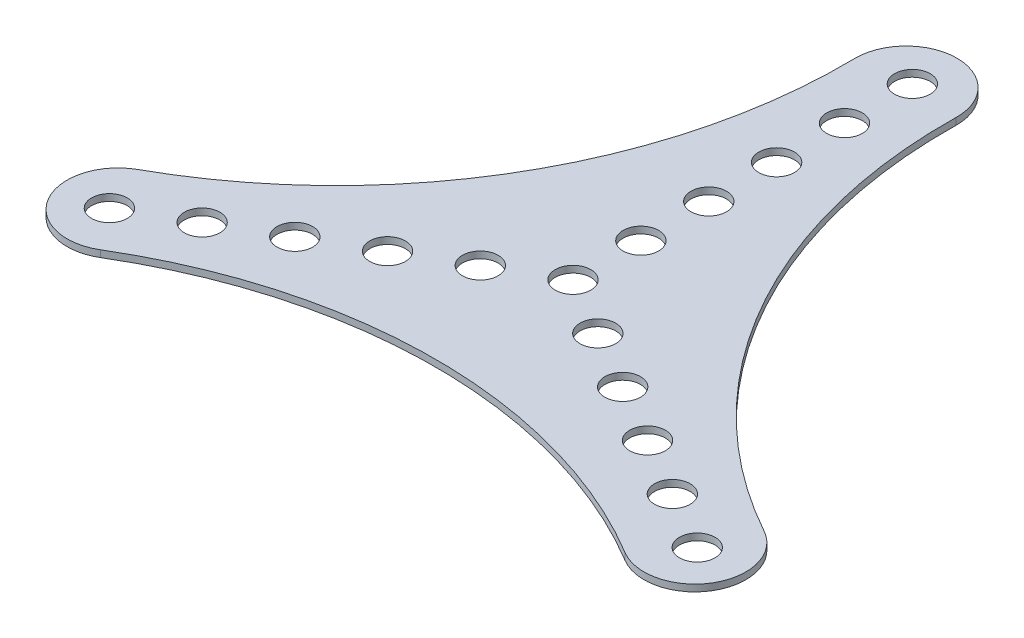
ISO-10303-21;
HEADER;
FILE_DESCRIPTION(('STEP AP214'),'2;1');
FILE_NAME('part.step','',(''),(''),'','','');
FILE_SCHEMA(('AUTOMOTIVE_DESIGN { 1 0 10303 214 1 1 1 1 }'));
ENDSEC;
DATA;
#1=APPLICATION_CONTEXT('core data for automotive mechanical design processes');
#2=APPLICATION_PROTOCOL_DEFINITION('international standard','automotive_design',2000,#1);
#3=PRODUCT_CONTEXT('',#1,'mechanical');
#4=PRODUCT('Part','Part','',(#3));
#5=PRODUCT_RELATED_PRODUCT_CATEGORY('part','',(#4));
#6=PRODUCT_DEFINITION_FORMATION('','',#4);
#7=PRODUCT_DEFINITION_CONTEXT('part definition',#1,'design');
#8=PRODUCT_DEFINITION('design','',#6,#7);
#9=PRODUCT_DEFINITION_SHAPE('','',#8);
#10=(LENGTH_UNIT() NAMED_UNIT(*) SI_UNIT(.MILLI.,.METRE.));
#11=(NAMED_UNIT(*) PLANE_ANGLE_UNIT() SI_UNIT($,.RADIAN.));
#12=(NAMED_UNIT(*) SI_UNIT($,.STERADIAN.) SOLID_ANGLE_UNIT());
#13=UNCERTAINTY_MEASURE_WITH_UNIT(LENGTH_MEASURE(1.E-05),#10,'distance_accuracy_value','');
#14=(GEOMETRIC_REPRESENTATION_CONTEXT(3) GLOBAL_UNCERTAINTY_ASSIGNED_CONTEXT((#13)) GLOBAL_UNIT_ASSIGNED_CONTEXT((#10,
#11,#12)) REPRESENTATION_CONTEXT('',''));
#15=CARTESIAN_POINT('',(0.,0.,0.));
#16=DIRECTION('',(0.,0.,1.));
#17=DIRECTION('',(1.,0.,0.));
#18=AXIS2_PLACEMENT_3D('',#15,#16,#17);
#19=CARTESIAN_POINT('',(164.974487139159,1.,-95.2480645592133));
#20=DIRECTION('',(0.,-1.,0.));
#21=DIRECTION('',(0.,0.,-1.));
#22=AXIS2_PLACEMENT_3D('',#19,#20,#21);
#23=CYLINDRICAL_SURFACE('',#22,150.);
#24=CARTESIAN_POINT('',(164.974487139159,-1.,-95.2480645592133));
#25=DIRECTION('',(0.,1.,0.));
#26=DIRECTION('',(0.,0.,1.));
#27=AXIS2_PLACEMENT_3D('',#24,#25,#26);
#28=CIRCLE('',#27,150.);
#29=CARTESIAN_POINT('',(14.9976806490144,-1.,-97.88577474378));
#30=VERTEX_POINT('',#29);
#31=CARTESIAN_POINT('',(92.2704079217417,-1.,35.9545149319977));
#32=VERTEX_POINT('',#31);
#33=EDGE_CURVE('E116',#30,#32,#28,.T.);
#34=ORIENTED_EDGE('',*,*,#33,.F.);
#35=DIRECTION('',(0.,-1.,0.));
#36=VECTOR('',#35,1.);
#37=CARTESIAN_POINT('',(14.9976806490144,1.,-97.88577474378));
#38=LINE('',#37,#36);
#39=CARTESIAN_POINT('',(14.9976806490144,1.,-97.88577474378));
#40=VERTEX_POINT('',#39);
#41=EDGE_CURVE('E11',#40,#30,#38,.T.);
#42=ORIENTED_EDGE('',*,*,#41,.F.);
#43=CARTESIAN_POINT('',(164.974487139159,1.,-95.2480645592133));
#44=DIRECTION('',(0.,1.,0.));
#45=DIRECTION('',(0.,0.,1.));
#46=AXIS2_PLACEMENT_3D('',#43,#44,#45);
#47=CIRCLE('',#46,150.);
#48=CARTESIAN_POINT('',(92.2704079217417,1.,35.9545149319977));
#49=VERTEX_POINT('',#48);
#50=EDGE_CURVE('E129',#40,#49,#47,.T.);
#51=ORIENTED_EDGE('',*,*,#50,.T.);
#52=DIRECTION('',(0.,-1.,0.));
#53=VECTOR('',#52,1.);
#54=CARTESIAN_POINT('',(92.2704079217417,1.,35.9545149319977));
#55=LINE('',#54,#53);
#56=EDGE_CURVE('E50',#49,#32,#55,.T.);
#57=ORIENTED_EDGE('',*,*,#56,.T.);
#58=EDGE_LOOP('',(#34,#42,#51,#57));
#59=FACE_BOUND('',#58,.T.);
#60=ADVANCED_FACE('F34',(#59),#23,.F.);
#61=CARTESIAN_POINT('',(0.,1.,-98.1495457622367));
#62=DIRECTION('',(0.,-1.,0.));
#63=DIRECTION('',(0.,0.,-1.));
#64=AXIS2_PLACEMENT_3D('',#61,#62,#63);
#65=CYLINDRICAL_SURFACE('',#64,15.);
#66=CARTESIAN_POINT('',(0.,-1.,-98.1495457622367));
#67=DIRECTION('',(0.,1.,0.));
#68=DIRECTION('',(0.,0.,1.));
#69=AXIS2_PLACEMENT_3D('',#66,#67,#68);
#70=CIRCLE('',#69,15.);
#71=CARTESIAN_POINT('',(-14.9976806490144,-1.,-97.88577474378));
#72=VERTEX_POINT('',#71);
#73=EDGE_CURVE('E118',#30,#72,#70,.T.);
#74=ORIENTED_EDGE('',*,*,#73,.T.);
#75=DIRECTION('',(0.,-1.,0.));
#76=VECTOR('',#75,1.);
#77=CARTESIAN_POINT('',(-14.9976806490144,1.,-97.88577474378));
#78=LINE('',#77,#76);
#79=CARTESIAN_POINT('',(-14.9976806490144,1.,-97.88577474378));
#80=VERTEX_POINT('',#79);
#81=EDGE_CURVE('E42',#80,#72,#78,.T.);
#82=ORIENTED_EDGE('',*,*,#81,.F.);
#83=CARTESIAN_POINT('',(0.,1.,-98.1495457622367));
#84=DIRECTION('',(0.,1.,0.));
#85=DIRECTION('',(0.,0.,1.));
#86=AXIS2_PLACEMENT_3D('',#83,#84,#85);
#87=CIRCLE('',#86,15.);
#88=EDGE_CURVE('E457',#40,#80,#87,.T.);
#89=ORIENTED_EDGE('',*,*,#88,.F.);
#90=ORIENTED_EDGE('',*,*,#41,.T.);
#91=EDGE_LOOP('',(#74,#82,#89,#90));
#92=FACE_BOUND('',#91,.T.);
#93=ADVANCED_FACE('F153',(#92),#65,.T.);
#94=CARTESIAN_POINT('',(-164.974487139159,1.,-95.2480645592133));
#95=DIRECTION('',(0.,-1.,0.));
#96=DIRECTION('',(0.,0.,-1.));
#97=AXIS2_PLACEMENT_3D('',#94,#95,#96);
#98=CYLINDRICAL_SURFACE('',#97,150.);
#99=CARTESIAN_POINT('',(-164.974487139159,-1.,-95.2480645592133));
#100=DIRECTION('',(0.,1.,0.));
#101=DIRECTION('',(0.,0.,1.));
#102=AXIS2_PLACEMENT_3D('',#99,#100,#101);
#103=CIRCLE('',#102,150.);
#104=CARTESIAN_POINT('',(-92.2704079217417,-1.,35.9545149319977));
#105=VERTEX_POINT('',#104);
#106=EDGE_CURVE('E121',#72,#105,#103,.F.);
#107=ORIENTED_EDGE('',*,*,#106,.T.);
#108=DIRECTION('',(0.,-1.,0.));
#109=VECTOR('',#108,1.);
#110=CARTESIAN_POINT('',(-92.2704079217417,1.,35.9545149319977));
#111=LINE('',#110,#109);
#112=CARTESIAN_POINT('',(-92.2704079217417,1.,35.9545149319977));
#113=VERTEX_POINT('',#112);
#114=EDGE_CURVE('E108',#113,#105,#111,.T.);
#115=ORIENTED_EDGE('',*,*,#114,.F.);
#116=CARTESIAN_POINT('',(-164.974487139159,1.,-95.2480645592133));
#117=DIRECTION('',(0.,1.,0.));
#118=DIRECTION('',(0.,0.,1.));
#119=AXIS2_PLACEMENT_3D('',#116,#117,#118);
#120=CIRCLE('',#119,150.);
#121=EDGE_CURVE('E96',#80,#113,#120,.F.);
#122=ORIENTED_EDGE('',*,*,#121,.F.);
#123=ORIENTED_EDGE('',*,*,#81,.T.);
#124=EDGE_LOOP('',(#107,#115,#122,#123));
#125=FACE_BOUND('',#124,.T.);
#126=ADVANCED_FACE('F136',(#125),#98,.F.);
#127=CARTESIAN_POINT('',(-85.,1.,49.0747728811188));
#128=DIRECTION('',(0.,-1.,0.));
#129=DIRECTION('',(0.,0.,-1.));
#130=AXIS2_PLACEMENT_3D('',#127,#128,#129);
#131=CYLINDRICAL_SURFACE('',#130,15.);
#132=CARTESIAN_POINT('',(-85.,-1.,49.0747728811188));
#133=DIRECTION('',(0.,1.,0.));
#134=DIRECTION('',(0.,0.,1.));
#135=AXIS2_PLACEMENT_3D('',#132,#133,#134);
#136=CIRCLE('',#135,15.);
#137=CARTESIAN_POINT('',(-77.2727272727273,-1.,61.9312598117833));
#138=VERTEX_POINT('',#137);
#139=EDGE_CURVE('E105',#105,#138,#136,.T.);
#140=ORIENTED_EDGE('',*,*,#139,.T.);
#141=DIRECTION('',(0.,-1.,0.));
#142=VECTOR('',#141,1.);
#143=CARTESIAN_POINT('',(-77.2727272727273,1.,61.9312598117833));
#144=LINE('',#143,#142);
#145=CARTESIAN_POINT('',(-77.2727272727273,1.,61.9312598117833));
#146=VERTEX_POINT('',#145);
#147=EDGE_CURVE('E102',#146,#138,#144,.T.);
#148=ORIENTED_EDGE('',*,*,#147,.F.);
#149=CARTESIAN_POINT('',(-85.,1.,49.0747728811188));
#150=DIRECTION('',(0.,1.,0.));
#151=DIRECTION('',(0.,0.,1.));
#152=AXIS2_PLACEMENT_3D('',#149,#150,#151);
#153=CIRCLE('',#152,15.);
#154=EDGE_CURVE('E88',#113,#146,#153,.T.);
#155=ORIENTED_EDGE('',*,*,#154,.F.);
#156=ORIENTED_EDGE('',*,*,#114,.T.);
#157=EDGE_LOOP('',(#140,#148,#155,#156));
#158=FACE_BOUND('',#157,.T.);
#159=ADVANCED_FACE('F103',(#158),#131,.T.);
#160=CARTESIAN_POINT('',(0.,1.,190.496129118428));
#161=DIRECTION('',(0.,-1.,0.));
#162=DIRECTION('',(0.,0.,-1.));
#163=AXIS2_PLACEMENT_3D('',#160,#161,#162);
#164=CYLINDRICAL_SURFACE('',#163,150.);
#165=CARTESIAN_POINT('',(0.,-1.,190.496129118428));
#166=DIRECTION('',(0.,1.,0.));
#167=DIRECTION('',(0.,0.,1.));
#168=AXIS2_PLACEMENT_3D('',#165,#166,#167);
#169=CIRCLE('',#168,150.);
#170=CARTESIAN_POINT('',(77.2727272727273,-1.,61.9312598117832));
#171=VERTEX_POINT('',#170);
#172=EDGE_CURVE('E124',#171,#138,#169,.T.);
#173=ORIENTED_EDGE('',*,*,#172,.F.);
#174=DIRECTION('',(0.,-1.,0.));
#175=VECTOR('',#174,1.);
#176=CARTESIAN_POINT('',(77.2727272727273,1.,61.9312598117832));
#177=LINE('',#176,#175);
#178=CARTESIAN_POINT('',(77.2727272727273,1.,61.9312598117832));
#179=VERTEX_POINT('',#178);
#180=EDGE_CURVE('E69',#179,#171,#177,.T.);
#181=ORIENTED_EDGE('',*,*,#180,.F.);
#182=CARTESIAN_POINT('',(0.,1.,190.496129118428));
#183=DIRECTION('',(0.,1.,0.));
#184=DIRECTION('',(0.,0.,1.));
#185=AXIS2_PLACEMENT_3D('',#182,#183,#184);
#186=CIRCLE('',#185,150.);
#187=EDGE_CURVE('E94',#179,#146,#186,.T.);
#188=ORIENTED_EDGE('',*,*,#187,.T.);
#189=ORIENTED_EDGE('',*,*,#147,.T.);
#190=EDGE_LOOP('',(#173,#181,#188,#189));
#191=FACE_BOUND('',#190,.T.);
#192=ADVANCED_FACE('F110',(#191),#164,.F.);
#193=CARTESIAN_POINT('',(85.,1.,49.0747728811187));
#194=DIRECTION('',(0.,-1.,0.));
#195=DIRECTION('',(0.,0.,-1.));
#196=AXIS2_PLACEMENT_3D('',#193,#194,#195);
#197=CYLINDRICAL_SURFACE('',#196,15.);
#198=CARTESIAN_POINT('',(85.,-1.,49.0747728811187));
#199=DIRECTION('',(0.,1.,0.));
#200=DIRECTION('',(0.,0.,1.));
#201=AXIS2_PLACEMENT_3D('',#198,#199,#200);
#202=CIRCLE('',#201,15.);
#203=EDGE_CURVE('E126',#32,#171,#202,.F.);
#204=ORIENTED_EDGE('',*,*,#203,.F.);
#205=ORIENTED_EDGE('',*,*,#56,.F.);
#206=CARTESIAN_POINT('',(85.,1.,49.0747728811187));
#207=DIRECTION('',(0.,1.,0.));
#208=DIRECTION('',(0.,0.,1.));
#209=AXIS2_PLACEMENT_3D('',#206,#207,#208);
#210=CIRCLE('',#209,15.);
#211=EDGE_CURVE('E111',#49,#179,#210,.F.);
#212=ORIENTED_EDGE('',*,*,#211,.T.);
#213=ORIENTED_EDGE('',*,*,#180,.T.);
#214=EDGE_LOOP('',(#204,#205,#212,#213));
#215=FACE_BOUND('',#214,.T.);
#216=ADVANCED_FACE('F141',(#215),#197,.T.);
#217=CARTESIAN_POINT('',(0.,1.,0.));
#218=DIRECTION('',(0.,1.,0.));
#219=DIRECTION('',(0.,0.,1.));
#220=AXIS2_PLACEMENT_3D('',#217,#218,#219);
#221=PLANE('',#220);
#222=CARTESIAN_POINT('',(69.2820323027555,1.,39.9999999999994));
#223=DIRECTION('',(0.,1.,0.));
#224=DIRECTION('',(-0.866025403784443,0.,-0.499999999999992));
#225=AXIS2_PLACEMENT_3D('',#222,#223,#224);
#226=CIRCLE('',#225,5.25);
#227=CARTESIAN_POINT('',(64.7353989328871,1.,37.3749999999994));
#228=VERTEX_POINT('',#227);
#229=EDGE_CURVE('E360',#228,#228,#226,.T.);
#230=ORIENTED_EDGE('',*,*,#229,.F.);
#231=EDGE_LOOP('',(#230));
#232=FACE_BOUND('',#231,.T.);
#233=CARTESIAN_POINT('',(-69.2820323027549,1.,40.0000000000003));
#234=DIRECTION('',(0.,1.,0.));
#235=DIRECTION('',(0.866025403784436,0.,-0.500000000000004));
#236=AXIS2_PLACEMENT_3D('',#233,#234,#235);
#237=CIRCLE('',#236,5.25);
#238=CARTESIAN_POINT('',(-64.7353989328866,1.,37.3750000000003));
#239=VERTEX_POINT('',#238);
#240=EDGE_CURVE('E364',#239,#239,#237,.T.);
#241=ORIENTED_EDGE('',*,*,#240,.F.);
#242=EDGE_LOOP('',(#241));
#243=FACE_BOUND('',#242,.T.);
#244=CARTESIAN_POINT('',(51.9615242270666,1.,29.9999999999995));
#245=DIRECTION('',(0.,1.,0.));
#246=DIRECTION('',(-0.866025403784443,0.,-0.499999999999992));
#247=AXIS2_PLACEMENT_3D('',#244,#245,#246);
#248=CIRCLE('',#247,5.25);
#249=CARTESIAN_POINT('',(47.4148908571983,1.,27.3749999999996));
#250=VERTEX_POINT('',#249);
#251=EDGE_CURVE('E373',#250,#250,#248,.T.);
#252=ORIENTED_EDGE('',*,*,#251,.F.);
#253=EDGE_LOOP('',(#252));
#254=FACE_BOUND('',#253,.T.);
#255=CARTESIAN_POINT('',(-51.9615242270662,1.,30.0000000000002));
#256=DIRECTION('',(0.,1.,0.));
#257=DIRECTION('',(0.866025403784436,0.,-0.500000000000004));
#258=AXIS2_PLACEMENT_3D('',#255,#256,#257);
#259=CIRCLE('',#258,5.25);
#260=CARTESIAN_POINT('',(-47.4148908571979,1.,27.3750000000002));
#261=VERTEX_POINT('',#260);
#262=EDGE_CURVE('E379',#261,#261,#259,.T.);
#263=ORIENTED_EDGE('',*,*,#262,.F.);
#264=EDGE_LOOP('',(#263));
#265=FACE_BOUND('',#264,.T.);
#266=CARTESIAN_POINT('',(34.6410161513777,1.,19.9999999999997));
#267=DIRECTION('',(0.,1.,0.));
#268=DIRECTION('',(-0.866025403784443,0.,-0.499999999999992));
#269=AXIS2_PLACEMENT_3D('',#266,#267,#268);
#270=CIRCLE('',#269,5.25);
#271=CARTESIAN_POINT('',(30.0943827815094,1.,17.3749999999997));
#272=VERTEX_POINT('',#271);
#273=EDGE_CURVE('E385',#272,#272,#270,.T.);
#274=ORIENTED_EDGE('',*,*,#273,.F.);
#275=EDGE_LOOP('',(#274));
#276=FACE_BOUND('',#275,.T.);
#277=CARTESIAN_POINT('',(-34.6410161513775,1.,20.0000000000002));
#278=DIRECTION('',(0.,1.,0.));
#279=DIRECTION('',(0.866025403784436,0.,-0.500000000000004));
#280=AXIS2_PLACEMENT_3D('',#277,#278,#279);
#281=CIRCLE('',#280,5.25);
#282=CARTESIAN_POINT('',(-30.0943827815092,1.,17.3750000000001));
#283=VERTEX_POINT('',#282);
#284=EDGE_CURVE('E391',#283,#283,#281,.T.);
#285=ORIENTED_EDGE('',*,*,#284,.F.);
#286=EDGE_LOOP('',(#285));
#287=FACE_BOUND('',#286,.T.);
#288=CARTESIAN_POINT('',(17.3205080756889,1.,9.99999999999984));
#289=DIRECTION('',(0.,1.,0.));
#290=DIRECTION('',(-0.866025403784443,0.,-0.499999999999992));
#291=AXIS2_PLACEMENT_3D('',#288,#289,#290);
#292=CIRCLE('',#291,5.25);
#293=CARTESIAN_POINT('',(12.7738747058205,1.,7.37499999999988));
#294=VERTEX_POINT('',#293);
#295=EDGE_CURVE('E397',#294,#294,#292,.T.);
#296=ORIENTED_EDGE('',*,*,#295,.F.);
#297=EDGE_LOOP('',(#296));
#298=FACE_BOUND('',#297,.T.);
#299=CARTESIAN_POINT('',(-17.3205080756887,1.,10.0000000000001));
#300=DIRECTION('',(0.,1.,0.));
#301=DIRECTION('',(0.866025403784436,0.,-0.500000000000004));
#302=AXIS2_PLACEMENT_3D('',#299,#300,#301);
#303=CIRCLE('',#302,5.25);
#304=CARTESIAN_POINT('',(-12.7738747058204,1.,7.37500000000006));
#305=VERTEX_POINT('',#304);
#306=EDGE_CURVE('E403',#305,#305,#303,.T.);
#307=ORIENTED_EDGE('',*,*,#306,.F.);
#308=EDGE_LOOP('',(#307));
#309=FACE_BOUND('',#308,.T.);
#310=CARTESIAN_POINT('',(86.6025403784443,1.,49.9999999999992));
#311=DIRECTION('',(0.,1.,0.));
#312=DIRECTION('',(-0.866025403784443,0.,-0.499999999999992));
#313=AXIS2_PLACEMENT_3D('',#310,#311,#312);
#314=CIRCLE('',#313,5.25);
#315=CARTESIAN_POINT('',(82.055907008576,1.,47.3749999999992));
#316=VERTEX_POINT('',#315);
#317=EDGE_CURVE('E409',#316,#316,#314,.T.);
#318=ORIENTED_EDGE('',*,*,#317,.F.);
#319=EDGE_LOOP('',(#318));
#320=FACE_BOUND('',#319,.T.);
#321=CARTESIAN_POINT('',(-86.6025403784437,1.,50.0000000000004));
#322=DIRECTION('',(0.,1.,0.));
#323=DIRECTION('',(0.866025403784436,0.,-0.500000000000004));
#324=AXIS2_PLACEMENT_3D('',#321,#322,#323);
#325=CIRCLE('',#324,5.25);
#326=CARTESIAN_POINT('',(-82.0559070085754,1.,47.3750000000004));
#327=VERTEX_POINT('',#326);
#328=EDGE_CURVE('E415',#327,#327,#325,.T.);
#329=ORIENTED_EDGE('',*,*,#328,.F.);
#330=EDGE_LOOP('',(#329));
#331=FACE_BOUND('',#330,.T.);
#332=CARTESIAN_POINT('',(0.,1.,-100.));
#333=DIRECTION('',(0.,1.,0.));
#334=DIRECTION('',(0.,0.,1.));
#335=AXIS2_PLACEMENT_3D('',#332,#333,#334);
#336=CIRCLE('',#335,5.25);
#337=CARTESIAN_POINT('',(0.,1.,-94.75));
#338=VERTEX_POINT('',#337);
#339=EDGE_CURVE('E421',#338,#338,#336,.T.);
#340=ORIENTED_EDGE('',*,*,#339,.F.);
#341=EDGE_LOOP('',(#340));
#342=FACE_BOUND('',#341,.T.);
#343=CARTESIAN_POINT('',(0.,1.,-80.));
#344=DIRECTION('',(0.,1.,0.));
#345=DIRECTION('',(0.,0.,1.));
#346=AXIS2_PLACEMENT_3D('',#343,#344,#345);
#347=CIRCLE('',#346,5.25);
#348=CARTESIAN_POINT('',(0.,1.,-74.75));
#349=VERTEX_POINT('',#348);
#350=EDGE_CURVE('E427',#349,#349,#347,.T.);
#351=ORIENTED_EDGE('',*,*,#350,.F.);
#352=EDGE_LOOP('',(#351));
#353=FACE_BOUND('',#352,.T.);
#354=CARTESIAN_POINT('',(0.,1.,-60.));
#355=DIRECTION('',(0.,1.,0.));
#356=DIRECTION('',(0.,0.,1.));
#357=AXIS2_PLACEMENT_3D('',#354,#355,#356);
#358=CIRCLE('',#357,5.25);
#359=CARTESIAN_POINT('',(0.,1.,-54.75));
#360=VERTEX_POINT('',#359);
#361=EDGE_CURVE('E433',#360,#360,#358,.T.);
#362=ORIENTED_EDGE('',*,*,#361,.F.);
#363=EDGE_LOOP('',(#362));
#364=FACE_BOUND('',#363,.T.);
#365=CARTESIAN_POINT('',(0.,1.,-40.));
#366=DIRECTION('',(0.,1.,0.));
#367=DIRECTION('',(0.,0.,1.));
#368=AXIS2_PLACEMENT_3D('',#365,#366,#367);
#369=CIRCLE('',#368,5.25);
#370=CARTESIAN_POINT('',(0.,1.,-34.75));
#371=VERTEX_POINT('',#370);
#372=EDGE_CURVE('E439',#371,#371,#369,.T.);
#373=ORIENTED_EDGE('',*,*,#372,.F.);
#374=EDGE_LOOP('',(#373));
#375=FACE_BOUND('',#374,.T.);
#376=CARTESIAN_POINT('',(0.,1.,-20.));
#377=DIRECTION('',(0.,1.,0.));
#378=DIRECTION('',(0.,0.,1.));
#379=AXIS2_PLACEMENT_3D('',#376,#377,#378);
#380=CIRCLE('',#379,5.25);
#381=CARTESIAN_POINT('',(0.,1.,-14.75));
#382=VERTEX_POINT('',#381);
#383=EDGE_CURVE('E445',#382,#382,#380,.T.);
#384=ORIENTED_EDGE('',*,*,#383,.F.);
#385=EDGE_LOOP('',(#384));
#386=FACE_BOUND('',#385,.T.);
#387=CARTESIAN_POINT('',(0.,1.,0.));
#388=DIRECTION('',(0.,1.,0.));
#389=DIRECTION('',(0.,0.,1.));
#390=AXIS2_PLACEMENT_3D('',#387,#388,#389);
#391=CIRCLE('',#390,5.25);
#392=CARTESIAN_POINT('',(0.,1.,5.25));
#393=VERTEX_POINT('',#392);
#394=EDGE_CURVE('E451',#393,#393,#391,.T.);
#395=ORIENTED_EDGE('',*,*,#394,.F.);
#396=EDGE_LOOP('',(#395));
#397=FACE_BOUND('',#396,.T.);
#398=ORIENTED_EDGE('',*,*,#50,.F.);
#399=ORIENTED_EDGE('',*,*,#88,.T.);
#400=ORIENTED_EDGE('',*,*,#121,.T.);
#401=ORIENTED_EDGE('',*,*,#154,.T.);
#402=ORIENTED_EDGE('',*,*,#187,.F.);
#403=ORIENTED_EDGE('',*,*,#211,.F.);
#404=EDGE_LOOP('',(#398,#399,#400,#401,#402,#403));
#405=FACE_BOUND('',#404,.T.);
#406=ADVANCED_FACE('F91',(#232,#243,#254,#265,#276,#287,#298,#309,#320,#331,#342,#353,#364,#375,
#386,#397,#405),#221,.T.);
#407=CARTESIAN_POINT('',(0.,-1.,0.));
#408=DIRECTION('',(0.,1.,0.));
#409=DIRECTION('',(0.,0.,1.));
#410=AXIS2_PLACEMENT_3D('',#407,#408,#409);
#411=PLANE('',#410);
#412=CARTESIAN_POINT('',(69.2820323027555,-1.,39.9999999999994));
#413=DIRECTION('',(0.,1.,0.));
#414=DIRECTION('',(-0.866025403784443,0.,-0.499999999999992));
#415=AXIS2_PLACEMENT_3D('',#412,#413,#414);
#416=CIRCLE('',#415,5.25);
#417=CARTESIAN_POINT('',(64.7353989328871,-1.,37.3749999999994));
#418=VERTEX_POINT('',#417);
#419=EDGE_CURVE('E363',#418,#418,#416,.F.);
#420=ORIENTED_EDGE('',*,*,#419,.F.);
#421=EDGE_LOOP('',(#420));
#422=FACE_BOUND('',#421,.T.);
#423=CARTESIAN_POINT('',(-69.2820323027549,-1.,40.0000000000003));
#424=DIRECTION('',(0.,1.,0.));
#425=DIRECTION('',(0.866025403784436,0.,-0.500000000000004));
#426=AXIS2_PLACEMENT_3D('',#423,#424,#425);
#427=CIRCLE('',#426,5.25);
#428=CARTESIAN_POINT('',(-64.7353989328866,-1.,37.3750000000003));
#429=VERTEX_POINT('',#428);
#430=EDGE_CURVE('E367',#429,#429,#427,.F.);
#431=ORIENTED_EDGE('',*,*,#430,.F.);
#432=EDGE_LOOP('',(#431));
#433=FACE_BOUND('',#432,.T.);
#434=CARTESIAN_POINT('',(51.9615242270666,-1.,29.9999999999995));
#435=DIRECTION('',(0.,1.,0.));
#436=DIRECTION('',(-0.866025403784443,0.,-0.499999999999992));
#437=AXIS2_PLACEMENT_3D('',#434,#435,#436);
#438=CIRCLE('',#437,5.25);
#439=CARTESIAN_POINT('',(47.4148908571983,-1.,27.3749999999996));
#440=VERTEX_POINT('',#439);
#441=EDGE_CURVE('E376',#440,#440,#438,.F.);
#442=ORIENTED_EDGE('',*,*,#441,.F.);
#443=EDGE_LOOP('',(#442));
#444=FACE_BOUND('',#443,.T.);
#445=CARTESIAN_POINT('',(-51.9615242270662,-1.,30.0000000000002));
#446=DIRECTION('',(0.,1.,0.));
#447=DIRECTION('',(0.866025403784436,0.,-0.500000000000004));
#448=AXIS2_PLACEMENT_3D('',#445,#446,#447);
#449=CIRCLE('',#448,5.25);
#450=CARTESIAN_POINT('',(-47.4148908571979,-1.,27.3750000000002));
#451=VERTEX_POINT('',#450);
#452=EDGE_CURVE('E382',#451,#451,#449,.F.);
#453=ORIENTED_EDGE('',*,*,#452,.F.);
#454=EDGE_LOOP('',(#453));
#455=FACE_BOUND('',#454,.T.);
#456=CARTESIAN_POINT('',(34.6410161513777,-1.,19.9999999999997));
#457=DIRECTION('',(0.,1.,0.));
#458=DIRECTION('',(-0.866025403784443,0.,-0.499999999999992));
#459=AXIS2_PLACEMENT_3D('',#456,#457,#458);
#460=CIRCLE('',#459,5.25);
#461=CARTESIAN_POINT('',(30.0943827815094,-1.,17.3749999999997));
#462=VERTEX_POINT('',#461);
#463=EDGE_CURVE('E388',#462,#462,#460,.F.);
#464=ORIENTED_EDGE('',*,*,#463,.F.);
#465=EDGE_LOOP('',(#464));
#466=FACE_BOUND('',#465,.T.);
#467=CARTESIAN_POINT('',(-34.6410161513775,-1.,20.0000000000002));
#468=DIRECTION('',(0.,1.,0.));
#469=DIRECTION('',(0.866025403784436,0.,-0.500000000000004));
#470=AXIS2_PLACEMENT_3D('',#467,#468,#469);
#471=CIRCLE('',#470,5.25);
#472=CARTESIAN_POINT('',(-30.0943827815092,-1.,17.3750000000001));
#473=VERTEX_POINT('',#472);
#474=EDGE_CURVE('E394',#473,#473,#471,.F.);
#475=ORIENTED_EDGE('',*,*,#474,.F.);
#476=EDGE_LOOP('',(#475));
#477=FACE_BOUND('',#476,.T.);
#478=CARTESIAN_POINT('',(17.3205080756889,-1.,9.99999999999984));
#479=DIRECTION('',(0.,1.,0.));
#480=DIRECTION('',(-0.866025403784443,0.,-0.499999999999992));
#481=AXIS2_PLACEMENT_3D('',#478,#479,#480);
#482=CIRCLE('',#481,5.25);
#483=CARTESIAN_POINT('',(12.7738747058205,-1.,7.37499999999988));
#484=VERTEX_POINT('',#483);
#485=EDGE_CURVE('E400',#484,#484,#482,.F.);
#486=ORIENTED_EDGE('',*,*,#485,.F.);
#487=EDGE_LOOP('',(#486));
#488=FACE_BOUND('',#487,.T.);
#489=CARTESIAN_POINT('',(-17.3205080756887,-1.,10.0000000000001));
#490=DIRECTION('',(0.,1.,0.));
#491=DIRECTION('',(0.866025403784436,0.,-0.500000000000004));
#492=AXIS2_PLACEMENT_3D('',#489,#490,#491);
#493=CIRCLE('',#492,5.25);
#494=CARTESIAN_POINT('',(-12.7738747058204,-1.,7.37500000000006));
#495=VERTEX_POINT('',#494);
#496=EDGE_CURVE('E406',#495,#495,#493,.F.);
#497=ORIENTED_EDGE('',*,*,#496,.F.);
#498=EDGE_LOOP('',(#497));
#499=FACE_BOUND('',#498,.T.);
#500=CARTESIAN_POINT('',(86.6025403784443,-1.,49.9999999999992));
#501=DIRECTION('',(0.,1.,0.));
#502=DIRECTION('',(-0.866025403784443,0.,-0.499999999999992));
#503=AXIS2_PLACEMENT_3D('',#500,#501,#502);
#504=CIRCLE('',#503,5.25);
#505=CARTESIAN_POINT('',(82.055907008576,-1.,47.3749999999992));
#506=VERTEX_POINT('',#505);
#507=EDGE_CURVE('E412',#506,#506,#504,.F.);
#508=ORIENTED_EDGE('',*,*,#507,.F.);
#509=EDGE_LOOP('',(#508));
#510=FACE_BOUND('',#509,.T.);
#511=CARTESIAN_POINT('',(-86.6025403784437,-1.,50.0000000000004));
#512=DIRECTION('',(0.,1.,0.));
#513=DIRECTION('',(0.866025403784436,0.,-0.500000000000004));
#514=AXIS2_PLACEMENT_3D('',#511,#512,#513);
#515=CIRCLE('',#514,5.25);
#516=CARTESIAN_POINT('',(-82.0559070085754,-1.,47.3750000000004));
#517=VERTEX_POINT('',#516);
#518=EDGE_CURVE('E418',#517,#517,#515,.F.);
#519=ORIENTED_EDGE('',*,*,#518,.F.);
#520=EDGE_LOOP('',(#519));
#521=FACE_BOUND('',#520,.T.);
#522=CARTESIAN_POINT('',(0.,-1.,-100.));
#523=DIRECTION('',(0.,1.,0.));
#524=DIRECTION('',(0.,0.,1.));
#525=AXIS2_PLACEMENT_3D('',#522,#523,#524);
#526=CIRCLE('',#525,5.25);
#527=CARTESIAN_POINT('',(0.,-1.,-94.75));
#528=VERTEX_POINT('',#527);
#529=EDGE_CURVE('E424',#528,#528,#526,.F.);
#530=ORIENTED_EDGE('',*,*,#529,.F.);
#531=EDGE_LOOP('',(#530));
#532=FACE_BOUND('',#531,.T.);
#533=CARTESIAN_POINT('',(0.,-1.,-80.));
#534=DIRECTION('',(0.,1.,0.));
#535=DIRECTION('',(0.,0.,1.));
#536=AXIS2_PLACEMENT_3D('',#533,#534,#535);
#537=CIRCLE('',#536,5.25);
#538=CARTESIAN_POINT('',(0.,-1.,-74.75));
#539=VERTEX_POINT('',#538);
#540=EDGE_CURVE('E430',#539,#539,#537,.F.);
#541=ORIENTED_EDGE('',*,*,#540,.F.);
#542=EDGE_LOOP('',(#541));
#543=FACE_BOUND('',#542,.T.);
#544=CARTESIAN_POINT('',(0.,-1.,-60.));
#545=DIRECTION('',(0.,1.,0.));
#546=DIRECTION('',(0.,0.,1.));
#547=AXIS2_PLACEMENT_3D('',#544,#545,#546);
#548=CIRCLE('',#547,5.25);
#549=CARTESIAN_POINT('',(0.,-1.,-54.75));
#550=VERTEX_POINT('',#549);
#551=EDGE_CURVE('E436',#550,#550,#548,.F.);
#552=ORIENTED_EDGE('',*,*,#551,.F.);
#553=EDGE_LOOP('',(#552));
#554=FACE_BOUND('',#553,.T.);
#555=CARTESIAN_POINT('',(0.,-1.,-40.));
#556=DIRECTION('',(0.,1.,0.));
#557=DIRECTION('',(0.,0.,1.));
#558=AXIS2_PLACEMENT_3D('',#555,#556,#557);
#559=CIRCLE('',#558,5.25);
#560=CARTESIAN_POINT('',(0.,-1.,-34.75));
#561=VERTEX_POINT('',#560);
#562=EDGE_CURVE('E442',#561,#561,#559,.F.);
#563=ORIENTED_EDGE('',*,*,#562,.F.);
#564=EDGE_LOOP('',(#563));
#565=FACE_BOUND('',#564,.T.);
#566=CARTESIAN_POINT('',(0.,-1.,-20.));
#567=DIRECTION('',(0.,1.,0.));
#568=DIRECTION('',(0.,0.,1.));
#569=AXIS2_PLACEMENT_3D('',#566,#567,#568);
#570=CIRCLE('',#569,5.25);
#571=CARTESIAN_POINT('',(0.,-1.,-14.75));
#572=VERTEX_POINT('',#571);
#573=EDGE_CURVE('E448',#572,#572,#570,.F.);
#574=ORIENTED_EDGE('',*,*,#573,.F.);
#575=EDGE_LOOP('',(#574));
#576=FACE_BOUND('',#575,.T.);
#577=CARTESIAN_POINT('',(0.,-1.,0.));
#578=DIRECTION('',(0.,1.,0.));
#579=DIRECTION('',(0.,0.,1.));
#580=AXIS2_PLACEMENT_3D('',#577,#578,#579);
#581=CIRCLE('',#580,5.25);
#582=CARTESIAN_POINT('',(0.,-1.,5.25));
#583=VERTEX_POINT('',#582);
#584=EDGE_CURVE('E119',#583,#583,#581,.F.);
#585=ORIENTED_EDGE('',*,*,#584,.F.);
#586=EDGE_LOOP('',(#585));
#587=FACE_BOUND('',#586,.T.);
#588=ORIENTED_EDGE('',*,*,#33,.T.);
#589=ORIENTED_EDGE('',*,*,#203,.T.);
#590=ORIENTED_EDGE('',*,*,#172,.T.);
#591=ORIENTED_EDGE('',*,*,#139,.F.);
#592=ORIENTED_EDGE('',*,*,#106,.F.);
#593=ORIENTED_EDGE('',*,*,#73,.F.);
#594=EDGE_LOOP('',(#588,#589,#590,#591,#592,#593));
#595=FACE_BOUND('',#594,.T.);
#596=ADVANCED_FACE('F140',(#422,#433,#444,#455,#466,#477,#488,#499,#510,#521,#532,#543,#554,
#565,#576,#587,#595),#411,.F.);
#597=CARTESIAN_POINT('',(0.,-1.001,0.));
#598=DIRECTION('',(0.,1.,0.));
#599=DIRECTION('',(0.,0.,1.));
#600=AXIS2_PLACEMENT_3D('',#597,#598,#599);
#601=CYLINDRICAL_SURFACE('',#600,5.25);
#602=ORIENTED_EDGE('',*,*,#394,.T.);
#603=EDGE_LOOP('',(#602));
#604=FACE_BOUND('',#603,.T.);
#605=ORIENTED_EDGE('',*,*,#584,.T.);
#606=EDGE_LOOP('',(#605));
#607=FACE_BOUND('',#606,.T.);
#608=ADVANCED_FACE('F181',(#604,#607),#601,.F.);
#609=CARTESIAN_POINT('',(0.,-1.001,-20.));
#610=DIRECTION('',(0.,1.,0.));
#611=DIRECTION('',(0.,0.,1.));
#612=AXIS2_PLACEMENT_3D('',#609,#610,#611);
#613=CYLINDRICAL_SURFACE('',#612,5.25);
#614=ORIENTED_EDGE('',*,*,#383,.T.);
#615=EDGE_LOOP('',(#614));
#616=FACE_BOUND('',#615,.T.);
#617=ORIENTED_EDGE('',*,*,#573,.T.);
#618=EDGE_LOOP('',(#617));
#619=FACE_BOUND('',#618,.T.);
#620=ADVANCED_FACE('F186',(#616,#619),#613,.F.);
#621=CARTESIAN_POINT('',(0.,-1.001,-40.));
#622=DIRECTION('',(0.,1.,0.));
#623=DIRECTION('',(0.,0.,1.));
#624=AXIS2_PLACEMENT_3D('',#621,#622,#623);
#625=CYLINDRICAL_SURFACE('',#624,5.25);
#626=ORIENTED_EDGE('',*,*,#372,.T.);
#627=EDGE_LOOP('',(#626));
#628=FACE_BOUND('',#627,.T.);
#629=ORIENTED_EDGE('',*,*,#562,.T.);
#630=EDGE_LOOP('',(#629));
#631=FACE_BOUND('',#630,.T.);
#632=ADVANCED_FACE('F198',(#628,#631),#625,.F.);
#633=CARTESIAN_POINT('',(0.,-1.001,-60.));
#634=DIRECTION('',(0.,1.,0.));
#635=DIRECTION('',(0.,0.,1.));
#636=AXIS2_PLACEMENT_3D('',#633,#634,#635);
#637=CYLINDRICAL_SURFACE('',#636,5.25);
#638=ORIENTED_EDGE('',*,*,#361,.T.);
#639=EDGE_LOOP('',(#638));
#640=FACE_BOUND('',#639,.T.);
#641=ORIENTED_EDGE('',*,*,#551,.T.);
#642=EDGE_LOOP('',(#641));
#643=FACE_BOUND('',#642,.T.);
#644=ADVANCED_FACE('F208',(#640,#643),#637,.F.);
#645=CARTESIAN_POINT('',(0.,-1.001,-80.));
#646=DIRECTION('',(0.,1.,0.));
#647=DIRECTION('',(0.,0.,1.));
#648=AXIS2_PLACEMENT_3D('',#645,#646,#647);
#649=CYLINDRICAL_SURFACE('',#648,5.25);
#650=ORIENTED_EDGE('',*,*,#350,.T.);
#651=EDGE_LOOP('',(#650));
#652=FACE_BOUND('',#651,.T.);
#653=ORIENTED_EDGE('',*,*,#540,.T.);
#654=EDGE_LOOP('',(#653));
#655=FACE_BOUND('',#654,.T.);
#656=ADVANCED_FACE('F218',(#652,#655),#649,.F.);
#657=CARTESIAN_POINT('',(0.,-1.001,-100.));
#658=DIRECTION('',(0.,1.,0.));
#659=DIRECTION('',(0.,0.,1.));
#660=AXIS2_PLACEMENT_3D('',#657,#658,#659);
#661=CYLINDRICAL_SURFACE('',#660,5.25);
#662=ORIENTED_EDGE('',*,*,#339,.T.);
#663=EDGE_LOOP('',(#662));
#664=FACE_BOUND('',#663,.T.);
#665=ORIENTED_EDGE('',*,*,#529,.T.);
#666=EDGE_LOOP('',(#665));
#667=FACE_BOUND('',#666,.T.);
#668=ADVANCED_FACE('F228',(#664,#667),#661,.F.);
#669=CARTESIAN_POINT('',(-86.6025403784437,-1.001,50.0000000000004));
#670=DIRECTION('',(0.,1.,0.));
#671=DIRECTION('',(0.866025403784436,0.,-0.500000000000004));
#672=AXIS2_PLACEMENT_3D('',#669,#670,#671);
#673=CYLINDRICAL_SURFACE('',#672,5.25);
#674=ORIENTED_EDGE('',*,*,#328,.T.);
#675=EDGE_LOOP('',(#674));
#676=FACE_BOUND('',#675,.T.);
#677=ORIENTED_EDGE('',*,*,#518,.T.);
#678=EDGE_LOOP('',(#677));
#679=FACE_BOUND('',#678,.T.);
#680=ADVANCED_FACE('F238',(#676,#679),#673,.F.);
#681=CARTESIAN_POINT('',(86.6025403784443,-1.001,49.9999999999992));
#682=DIRECTION('',(0.,1.,0.));
#683=DIRECTION('',(-0.866025403784443,0.,-0.499999999999992));
#684=AXIS2_PLACEMENT_3D('',#681,#682,#683);
#685=CYLINDRICAL_SURFACE('',#684,5.25);
#686=ORIENTED_EDGE('',*,*,#317,.T.);
#687=EDGE_LOOP('',(#686));
#688=FACE_BOUND('',#687,.T.);
#689=ORIENTED_EDGE('',*,*,#507,.T.);
#690=EDGE_LOOP('',(#689));
#691=FACE_BOUND('',#690,.T.);
#692=ADVANCED_FACE('F263',(#688,#691),#685,.F.);
#693=CARTESIAN_POINT('',(-17.3205080756887,-1.001,10.0000000000001));
#694=DIRECTION('',(0.,1.,0.));
#695=DIRECTION('',(0.866025403784436,0.,-0.500000000000004));
#696=AXIS2_PLACEMENT_3D('',#693,#694,#695);
#697=CYLINDRICAL_SURFACE('',#696,5.25);
#698=ORIENTED_EDGE('',*,*,#306,.T.);
#699=EDGE_LOOP('',(#698));
#700=FACE_BOUND('',#699,.T.);
#701=ORIENTED_EDGE('',*,*,#496,.T.);
#702=EDGE_LOOP('',(#701));
#703=FACE_BOUND('',#702,.T.);
#704=ADVANCED_FACE('F273',(#700,#703),#697,.F.);
#705=CARTESIAN_POINT('',(17.3205080756889,-1.001,9.99999999999984));
#706=DIRECTION('',(0.,1.,0.));
#707=DIRECTION('',(-0.866025403784443,0.,-0.499999999999992));
#708=AXIS2_PLACEMENT_3D('',#705,#706,#707);
#709=CYLINDRICAL_SURFACE('',#708,5.25);
#710=ORIENTED_EDGE('',*,*,#295,.T.);
#711=EDGE_LOOP('',(#710));
#712=FACE_BOUND('',#711,.T.);
#713=ORIENTED_EDGE('',*,*,#485,.T.);
#714=EDGE_LOOP('',(#713));
#715=FACE_BOUND('',#714,.T.);
#716=ADVANCED_FACE('F283',(#712,#715),#709,.F.);
#717=CARTESIAN_POINT('',(-34.6410161513775,-1.001,20.0000000000002));
#718=DIRECTION('',(0.,1.,0.));
#719=DIRECTION('',(0.866025403784436,0.,-0.500000000000004));
#720=AXIS2_PLACEMENT_3D('',#717,#718,#719);
#721=CYLINDRICAL_SURFACE('',#720,5.25);
#722=ORIENTED_EDGE('',*,*,#284,.T.);
#723=EDGE_LOOP('',(#722));
#724=FACE_BOUND('',#723,.T.);
#725=ORIENTED_EDGE('',*,*,#474,.T.);
#726=EDGE_LOOP('',(#725));
#727=FACE_BOUND('',#726,.T.);
#728=ADVANCED_FACE('F293',(#724,#727),#721,.F.);
#729=CARTESIAN_POINT('',(34.6410161513777,-1.001,19.9999999999997));
#730=DIRECTION('',(0.,1.,0.));
#731=DIRECTION('',(-0.866025403784443,0.,-0.499999999999992));
#732=AXIS2_PLACEMENT_3D('',#729,#730,#731);
#733=CYLINDRICAL_SURFACE('',#732,5.25);
#734=ORIENTED_EDGE('',*,*,#273,.T.);
#735=EDGE_LOOP('',(#734));
#736=FACE_BOUND('',#735,.T.);
#737=ORIENTED_EDGE('',*,*,#463,.T.);
#738=EDGE_LOOP('',(#737));
#739=FACE_BOUND('',#738,.T.);
#740=ADVANCED_FACE('F303',(#736,#739),#733,.F.);
#741=CARTESIAN_POINT('',(-51.9615242270662,-1.001,30.0000000000002));
#742=DIRECTION('',(0.,1.,0.));
#743=DIRECTION('',(0.866025403784436,0.,-0.500000000000004));
#744=AXIS2_PLACEMENT_3D('',#741,#742,#743);
#745=CYLINDRICAL_SURFACE('',#744,5.25);
#746=ORIENTED_EDGE('',*,*,#262,.T.);
#747=EDGE_LOOP('',(#746));
#748=FACE_BOUND('',#747,.T.);
#749=ORIENTED_EDGE('',*,*,#452,.T.);
#750=EDGE_LOOP('',(#749));
#751=FACE_BOUND('',#750,.T.);
#752=ADVANCED_FACE('F313',(#748,#751),#745,.F.);
#753=CARTESIAN_POINT('',(51.9615242270666,-1.001,29.9999999999995));
#754=DIRECTION('',(0.,1.,0.));
#755=DIRECTION('',(-0.866025403784443,0.,-0.499999999999992));
#756=AXIS2_PLACEMENT_3D('',#753,#754,#755);
#757=CYLINDRICAL_SURFACE('',#756,5.25);
#758=ORIENTED_EDGE('',*,*,#251,.T.);
#759=EDGE_LOOP('',(#758));
#760=FACE_BOUND('',#759,.T.);
#761=ORIENTED_EDGE('',*,*,#441,.T.);
#762=EDGE_LOOP('',(#761));
#763=FACE_BOUND('',#762,.T.);
#764=ADVANCED_FACE('F323',(#760,#763),#757,.F.);
#765=CARTESIAN_POINT('',(-69.2820323027549,-1.001,40.0000000000003));
#766=DIRECTION('',(0.,1.,0.));
#767=DIRECTION('',(0.866025403784436,0.,-0.500000000000004));
#768=AXIS2_PLACEMENT_3D('',#765,#766,#767);
#769=CYLINDRICAL_SURFACE('',#768,5.25);
#770=ORIENTED_EDGE('',*,*,#240,.T.);
#771=EDGE_LOOP('',(#770));
#772=FACE_BOUND('',#771,.T.);
#773=ORIENTED_EDGE('',*,*,#430,.T.);
#774=EDGE_LOOP('',(#773));
#775=FACE_BOUND('',#774,.T.);
#776=ADVANCED_FACE('F333',(#772,#775),#769,.F.);
#777=CARTESIAN_POINT('',(69.2820323027555,-1.001,39.9999999999994));
#778=DIRECTION('',(0.,1.,0.));
#779=DIRECTION('',(-0.866025403784443,0.,-0.499999999999992));
#780=AXIS2_PLACEMENT_3D('',#777,#778,#779);
#781=CYLINDRICAL_SURFACE('',#780,5.25);
#782=ORIENTED_EDGE('',*,*,#229,.T.);
#783=EDGE_LOOP('',(#782));
#784=FACE_BOUND('',#783,.T.);
#785=ORIENTED_EDGE('',*,*,#419,.T.);
#786=EDGE_LOOP('',(#785));
#787=FACE_BOUND('',#786,.T.);
#788=ADVANCED_FACE('F343',(#784,#787),#781,.F.);
#789=CLOSED_SHELL('',(#60,#93,#126,#159,#192,#216,#406,#596,#608,#620,#632,#644,#656,#668,#680,
#692,#704,#716,#728,#740,#752,#764,#776,#788));
#790=MANIFOLD_SOLID_BREP('B2',#789);
#791=ADVANCED_BREP_SHAPE_REPRESENTATION('',(#18,#790),#14);
#792=SHAPE_DEFINITION_REPRESENTATION(#9,#791);
ENDSEC;
END-ISO-10303-21;
